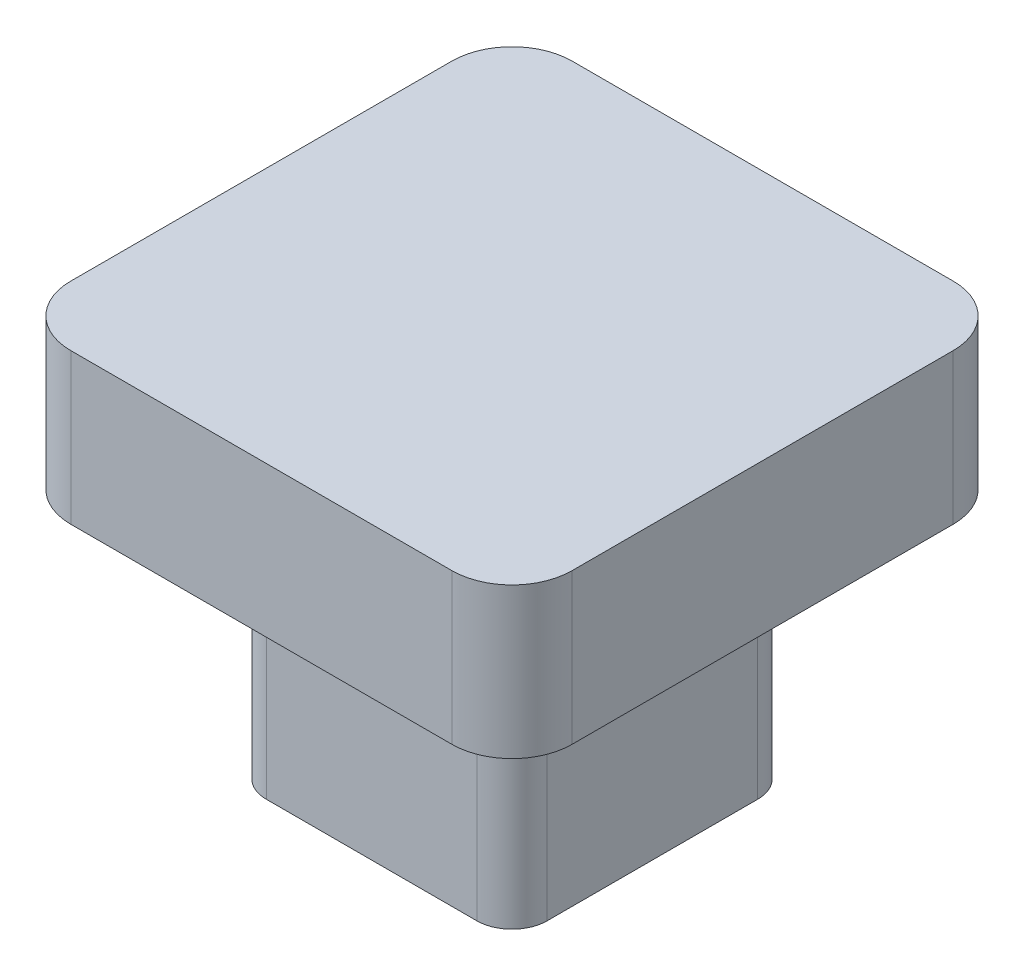
ISO-10303-21;
HEADER;
FILE_DESCRIPTION(('STEP AP214'),'2;1');
FILE_NAME('part.step','',(''),(''),'','','');
FILE_SCHEMA(('AUTOMOTIVE_DESIGN { 1 0 10303 214 1 1 1 1 }'));
ENDSEC;
DATA;
#1=APPLICATION_CONTEXT('core data for automotive mechanical design processes');
#2=APPLICATION_PROTOCOL_DEFINITION('international standard','automotive_design',2000,#1);
#3=PRODUCT_CONTEXT('',#1,'mechanical');
#4=PRODUCT('Part','Part','',(#3));
#5=PRODUCT_RELATED_PRODUCT_CATEGORY('part','',(#4));
#6=PRODUCT_DEFINITION_FORMATION('','',#4);
#7=PRODUCT_DEFINITION_CONTEXT('part definition',#1,'design');
#8=PRODUCT_DEFINITION('design','',#6,#7);
#9=PRODUCT_DEFINITION_SHAPE('','',#8);
#10=(LENGTH_UNIT() NAMED_UNIT(*) SI_UNIT(.MILLI.,.METRE.));
#11=(NAMED_UNIT(*) PLANE_ANGLE_UNIT() SI_UNIT($,.RADIAN.));
#12=(NAMED_UNIT(*) SI_UNIT($,.STERADIAN.) SOLID_ANGLE_UNIT());
#13=UNCERTAINTY_MEASURE_WITH_UNIT(LENGTH_MEASURE(1.E-05),#10,'distance_accuracy_value','');
#14=(GEOMETRIC_REPRESENTATION_CONTEXT(3) GLOBAL_UNCERTAINTY_ASSIGNED_CONTEXT((#13)) GLOBAL_UNIT_ASSIGNED_CONTEXT((#10,
#11,#12)) REPRESENTATION_CONTEXT('',''));
#15=CARTESIAN_POINT('',(0.,0.,0.));
#16=DIRECTION('',(0.,0.,1.));
#17=DIRECTION('',(1.,0.,0.));
#18=AXIS2_PLACEMENT_3D('',#15,#16,#17);
#19=CARTESIAN_POINT('',(-2.8,-5.,-2.8));
#20=DIRECTION('',(0.,1.,0.));
#21=DIRECTION('',(1.,0.,0.));
#22=AXIS2_PLACEMENT_3D('',#19,#20,#21);
#23=PLANE('',#22);
#24=CARTESIAN_POINT('',(2.1,-5.,-2.1));
#25=DIRECTION('',(0.,1.,0.));
#26=DIRECTION('',(0.,0.,1.));
#27=AXIS2_PLACEMENT_3D('',#24,#25,#26);
#28=CIRCLE('',#27,0.7);
#29=CARTESIAN_POINT('',(2.8,-5.,-2.1));
#30=VERTEX_POINT('',#29);
#31=CARTESIAN_POINT('',(2.1,-5.,-2.8));
#32=VERTEX_POINT('',#31);
#33=EDGE_CURVE('E322',#30,#32,#28,.T.);
#34=ORIENTED_EDGE('',*,*,#33,.F.);
#35=DIRECTION('',(0.,0.,1.));
#36=VECTOR('',#35,1.);
#37=CARTESIAN_POINT('',(2.8,-5.,-2.8));
#38=LINE('',#37,#36);
#39=CARTESIAN_POINT('',(2.8,-5.,2.1));
#40=VERTEX_POINT('',#39);
#41=EDGE_CURVE('E323',#30,#40,#38,.T.);
#42=ORIENTED_EDGE('',*,*,#41,.T.);
#43=CARTESIAN_POINT('',(2.1,-5.,2.1));
#44=DIRECTION('',(0.,-1.,0.));
#45=DIRECTION('',(0.,0.,1.));
#46=AXIS2_PLACEMENT_3D('',#43,#44,#45);
#47=CIRCLE('',#46,0.7);
#48=CARTESIAN_POINT('',(2.1,-5.,2.8));
#49=VERTEX_POINT('',#48);
#50=EDGE_CURVE('E202',#40,#49,#47,.T.);
#51=ORIENTED_EDGE('',*,*,#50,.T.);
#52=DIRECTION('',(1.,0.,0.));
#53=VECTOR('',#52,1.);
#54=CARTESIAN_POINT('',(-2.8,-5.,2.8));
#55=LINE('',#54,#53);
#56=CARTESIAN_POINT('',(-2.1,-5.,2.8));
#57=VERTEX_POINT('',#56);
#58=EDGE_CURVE('E330',#57,#49,#55,.T.);
#59=ORIENTED_EDGE('',*,*,#58,.F.);
#60=CARTESIAN_POINT('',(-2.1,-5.,2.1));
#61=DIRECTION('',(0.,1.,0.));
#62=DIRECTION('',(0.,0.,1.));
#63=AXIS2_PLACEMENT_3D('',#60,#61,#62);
#64=CIRCLE('',#63,0.7);
#65=CARTESIAN_POINT('',(-2.8,-5.,2.1));
#66=VERTEX_POINT('',#65);
#67=EDGE_CURVE('E241',#66,#57,#64,.T.);
#68=ORIENTED_EDGE('',*,*,#67,.F.);
#69=DIRECTION('',(0.,0.,1.));
#70=VECTOR('',#69,1.);
#71=CARTESIAN_POINT('',(-2.8,-5.,-2.8));
#72=LINE('',#71,#70);
#73=CARTESIAN_POINT('',(-2.8,-5.,-2.1));
#74=VERTEX_POINT('',#73);
#75=EDGE_CURVE('E237',#74,#66,#72,.T.);
#76=ORIENTED_EDGE('',*,*,#75,.F.);
#77=CARTESIAN_POINT('',(-2.1,-5.,-2.1));
#78=DIRECTION('',(0.,-1.,0.));
#79=DIRECTION('',(0.,0.,1.));
#80=AXIS2_PLACEMENT_3D('',#77,#78,#79);
#81=CIRCLE('',#80,0.7);
#82=CARTESIAN_POINT('',(-2.1,-5.,-2.8));
#83=VERTEX_POINT('',#82);
#84=EDGE_CURVE('E9',#74,#83,#81,.T.);
#85=ORIENTED_EDGE('',*,*,#84,.T.);
#86=DIRECTION('',(1.,0.,0.));
#87=VECTOR('',#86,1.);
#88=CARTESIAN_POINT('',(-2.8,-5.,-2.8));
#89=LINE('',#88,#87);
#90=EDGE_CURVE('E40',#83,#32,#89,.T.);
#91=ORIENTED_EDGE('',*,*,#90,.T.);
#92=EDGE_LOOP('',(#34,#42,#51,#59,#68,#76,#85,#91));
#93=FACE_BOUND('',#92,.T.);
#94=ADVANCED_FACE('F15',(#93),#23,.F.);
#95=CARTESIAN_POINT('',(-2.1,-5.,-2.1));
#96=DIRECTION('',(0.,1.,0.));
#97=DIRECTION('',(-1.,0.,0.));
#98=AXIS2_PLACEMENT_3D('',#95,#96,#97);
#99=CYLINDRICAL_SURFACE('',#98,0.7);
#100=DIRECTION('',(0.,1.,0.));
#101=VECTOR('',#100,1.);
#102=CARTESIAN_POINT('',(-2.8,-5.,-2.1));
#103=LINE('',#102,#101);
#104=CARTESIAN_POINT('',(-2.8,0.,-2.1));
#105=VERTEX_POINT('',#104);
#106=EDGE_CURVE('E242',#74,#105,#103,.T.);
#107=ORIENTED_EDGE('',*,*,#106,.T.);
#108=CARTESIAN_POINT('',(-2.1,0.,-2.1));
#109=DIRECTION('',(0.,-1.,0.));
#110=DIRECTION('',(0.,0.,1.));
#111=AXIS2_PLACEMENT_3D('',#108,#109,#110);
#112=CIRCLE('',#111,0.7);
#113=CARTESIAN_POINT('',(-2.1,0.,-2.8));
#114=VERTEX_POINT('',#113);
#115=EDGE_CURVE('E254',#105,#114,#112,.T.);
#116=ORIENTED_EDGE('',*,*,#115,.T.);
#117=DIRECTION('',(0.,1.,0.));
#118=VECTOR('',#117,1.);
#119=CARTESIAN_POINT('',(-2.1,-5.,-2.8));
#120=LINE('',#119,#118);
#121=EDGE_CURVE('E23',#83,#114,#120,.T.);
#122=ORIENTED_EDGE('',*,*,#121,.F.);
#123=ORIENTED_EDGE('',*,*,#84,.F.);
#124=EDGE_LOOP('',(#107,#116,#122,#123));
#125=FACE_BOUND('',#124,.T.);
#126=ADVANCED_FACE('F379',(#125),#99,.T.);
#127=CARTESIAN_POINT('',(-2.8,-5.,-2.8));
#128=DIRECTION('',(0.,0.,1.));
#129=DIRECTION('',(1.,0.,0.));
#130=AXIS2_PLACEMENT_3D('',#127,#128,#129);
#131=PLANE('',#130);
#132=DIRECTION('',(0.,1.,0.));
#133=VECTOR('',#132,1.);
#134=CARTESIAN_POINT('',(2.1,-5.,-2.8));
#135=LINE('',#134,#133);
#136=CARTESIAN_POINT('',(2.1,0.,-2.8));
#137=VERTEX_POINT('',#136);
#138=EDGE_CURVE('E287',#32,#137,#135,.T.);
#139=ORIENTED_EDGE('',*,*,#138,.F.);
#140=ORIENTED_EDGE('',*,*,#90,.F.);
#141=ORIENTED_EDGE('',*,*,#121,.T.);
#142=DIRECTION('',(1.,0.,0.));
#143=VECTOR('',#142,1.);
#144=CARTESIAN_POINT('',(-2.8,0.,-2.8));
#145=LINE('',#144,#143);
#146=EDGE_CURVE('E259',#114,#137,#145,.T.);
#147=ORIENTED_EDGE('',*,*,#146,.T.);
#148=EDGE_LOOP('',(#139,#140,#141,#147));
#149=FACE_BOUND('',#148,.T.);
#150=ADVANCED_FACE('F351',(#149),#131,.F.);
#151=CARTESIAN_POINT('',(2.1,-5.,-2.1));
#152=DIRECTION('',(0.,1.,0.));
#153=DIRECTION('',(1.,0.,0.));
#154=AXIS2_PLACEMENT_3D('',#151,#152,#153);
#155=CYLINDRICAL_SURFACE('',#154,0.7);
#156=ORIENTED_EDGE('',*,*,#33,.T.);
#157=ORIENTED_EDGE('',*,*,#138,.T.);
#158=CARTESIAN_POINT('',(2.1,0.,-2.1));
#159=DIRECTION('',(0.,1.,0.));
#160=DIRECTION('',(0.,0.,1.));
#161=AXIS2_PLACEMENT_3D('',#158,#159,#160);
#162=CIRCLE('',#161,0.7);
#163=CARTESIAN_POINT('',(2.8,0.,-2.1));
#164=VERTEX_POINT('',#163);
#165=EDGE_CURVE('E247',#164,#137,#162,.T.);
#166=ORIENTED_EDGE('',*,*,#165,.F.);
#167=DIRECTION('',(0.,1.,0.));
#168=VECTOR('',#167,1.);
#169=CARTESIAN_POINT('',(2.8,-5.,-2.1));
#170=LINE('',#169,#168);
#171=EDGE_CURVE('E319',#30,#164,#170,.T.);
#172=ORIENTED_EDGE('',*,*,#171,.F.);
#173=EDGE_LOOP('',(#156,#157,#166,#172));
#174=FACE_BOUND('',#173,.T.);
#175=ADVANCED_FACE('F346',(#174),#155,.T.);
#176=CARTESIAN_POINT('',(2.8,-5.,-2.8));
#177=DIRECTION('',(1.,0.,0.));
#178=DIRECTION('',(0.,1.,0.));
#179=AXIS2_PLACEMENT_3D('',#176,#177,#178);
#180=PLANE('',#179);
#181=ORIENTED_EDGE('',*,*,#41,.F.);
#182=ORIENTED_EDGE('',*,*,#171,.T.);
#183=DIRECTION('',(0.,0.,1.));
#184=VECTOR('',#183,1.);
#185=CARTESIAN_POINT('',(2.8,0.,-2.8));
#186=LINE('',#185,#184);
#187=CARTESIAN_POINT('',(2.8,0.,2.1));
#188=VERTEX_POINT('',#187);
#189=EDGE_CURVE('E243',#164,#188,#186,.T.);
#190=ORIENTED_EDGE('',*,*,#189,.T.);
#191=DIRECTION('',(0.,1.,0.));
#192=VECTOR('',#191,1.);
#193=CARTESIAN_POINT('',(2.8,-5.,2.1));
#194=LINE('',#193,#192);
#195=EDGE_CURVE('E210',#40,#188,#194,.T.);
#196=ORIENTED_EDGE('',*,*,#195,.F.);
#197=EDGE_LOOP('',(#181,#182,#190,#196));
#198=FACE_BOUND('',#197,.T.);
#199=ADVANCED_FACE('F358',(#198),#180,.T.);
#200=CARTESIAN_POINT('',(2.1,-5.,2.1));
#201=DIRECTION('',(0.,1.,0.));
#202=DIRECTION('',(1.,0.,0.));
#203=AXIS2_PLACEMENT_3D('',#200,#201,#202);
#204=CYLINDRICAL_SURFACE('',#203,0.7);
#205=ORIENTED_EDGE('',*,*,#195,.T.);
#206=CARTESIAN_POINT('',(2.1,0.,2.1));
#207=DIRECTION('',(0.,-1.,0.));
#208=DIRECTION('',(0.,0.,1.));
#209=AXIS2_PLACEMENT_3D('',#206,#207,#208);
#210=CIRCLE('',#209,0.7);
#211=CARTESIAN_POINT('',(2.1,0.,2.8));
#212=VERTEX_POINT('',#211);
#213=EDGE_CURVE('E232',#188,#212,#210,.T.);
#214=ORIENTED_EDGE('',*,*,#213,.T.);
#215=DIRECTION('',(0.,1.,0.));
#216=VECTOR('',#215,1.);
#217=CARTESIAN_POINT('',(2.1,-5.,2.8));
#218=LINE('',#217,#216);
#219=EDGE_CURVE('E213',#49,#212,#218,.T.);
#220=ORIENTED_EDGE('',*,*,#219,.F.);
#221=ORIENTED_EDGE('',*,*,#50,.F.);
#222=EDGE_LOOP('',(#205,#214,#220,#221));
#223=FACE_BOUND('',#222,.T.);
#224=ADVANCED_FACE('F362',(#223),#204,.T.);
#225=CARTESIAN_POINT('',(-2.8,-5.,2.8));
#226=DIRECTION('',(0.,0.,1.));
#227=DIRECTION('',(1.,0.,0.));
#228=AXIS2_PLACEMENT_3D('',#225,#226,#227);
#229=PLANE('',#228);
#230=DIRECTION('',(1.,0.,0.));
#231=VECTOR('',#230,1.);
#232=CARTESIAN_POINT('',(-2.8,0.,2.8));
#233=LINE('',#232,#231);
#234=CARTESIAN_POINT('',(-2.1,0.,2.8));
#235=VERTEX_POINT('',#234);
#236=EDGE_CURVE('E228',#235,#212,#233,.T.);
#237=ORIENTED_EDGE('',*,*,#236,.F.);
#238=DIRECTION('',(0.,1.,0.));
#239=VECTOR('',#238,1.);
#240=CARTESIAN_POINT('',(-2.1,-5.,2.8));
#241=LINE('',#240,#239);
#242=EDGE_CURVE('E280',#57,#235,#241,.T.);
#243=ORIENTED_EDGE('',*,*,#242,.F.);
#244=ORIENTED_EDGE('',*,*,#58,.T.);
#245=ORIENTED_EDGE('',*,*,#219,.T.);
#246=EDGE_LOOP('',(#237,#243,#244,#245));
#247=FACE_BOUND('',#246,.T.);
#248=ADVANCED_FACE('F369',(#247),#229,.T.);
#249=CARTESIAN_POINT('',(-2.1,-5.,2.1));
#250=DIRECTION('',(0.,1.,0.));
#251=DIRECTION('',(-1.,0.,0.));
#252=AXIS2_PLACEMENT_3D('',#249,#250,#251);
#253=CYLINDRICAL_SURFACE('',#252,0.7);
#254=ORIENTED_EDGE('',*,*,#67,.T.);
#255=ORIENTED_EDGE('',*,*,#242,.T.);
#256=CARTESIAN_POINT('',(-2.1,0.,2.1));
#257=DIRECTION('',(0.,1.,0.));
#258=DIRECTION('',(0.,0.,1.));
#259=AXIS2_PLACEMENT_3D('',#256,#257,#258);
#260=CIRCLE('',#259,0.7);
#261=CARTESIAN_POINT('',(-2.8,0.,2.1));
#262=VERTEX_POINT('',#261);
#263=EDGE_CURVE('E233',#262,#235,#260,.T.);
#264=ORIENTED_EDGE('',*,*,#263,.F.);
#265=DIRECTION('',(0.,1.,0.));
#266=VECTOR('',#265,1.);
#267=CARTESIAN_POINT('',(-2.8,-5.,2.1));
#268=LINE('',#267,#266);
#269=EDGE_CURVE('E310',#66,#262,#268,.T.);
#270=ORIENTED_EDGE('',*,*,#269,.F.);
#271=EDGE_LOOP('',(#254,#255,#264,#270));
#272=FACE_BOUND('',#271,.T.);
#273=ADVANCED_FACE('F377',(#272),#253,.T.);
#274=CARTESIAN_POINT('',(-2.8,-5.,-2.8));
#275=DIRECTION('',(1.,0.,0.));
#276=DIRECTION('',(0.,1.,0.));
#277=AXIS2_PLACEMENT_3D('',#274,#275,#276);
#278=PLANE('',#277);
#279=ORIENTED_EDGE('',*,*,#269,.T.);
#280=DIRECTION('',(0.,0.,1.));
#281=VECTOR('',#280,1.);
#282=CARTESIAN_POINT('',(-2.8,0.,-2.8));
#283=LINE('',#282,#281);
#284=EDGE_CURVE('E258',#105,#262,#283,.T.);
#285=ORIENTED_EDGE('',*,*,#284,.F.);
#286=ORIENTED_EDGE('',*,*,#106,.F.);
#287=ORIENTED_EDGE('',*,*,#75,.T.);
#288=EDGE_LOOP('',(#279,#285,#286,#287));
#289=FACE_BOUND('',#288,.T.);
#290=ADVANCED_FACE('F374',(#289),#278,.F.);
#291=CARTESIAN_POINT('',(-5.,0.,5.));
#292=DIRECTION('',(0.,0.,1.));
#293=DIRECTION('',(1.,0.,0.));
#294=AXIS2_PLACEMENT_3D('',#291,#292,#293);
#295=PLANE('',#294);
#296=DIRECTION('',(1.,0.,0.));
#297=VECTOR('',#296,1.);
#298=CARTESIAN_POINT('',(-5.,3.,5.));
#299=LINE('',#298,#297);
#300=CARTESIAN_POINT('',(-3.8,3.,5.));
#301=VERTEX_POINT('',#300);
#302=CARTESIAN_POINT('',(3.8,3.,5.));
#303=VERTEX_POINT('',#302);
#304=EDGE_CURVE('E214',#301,#303,#299,.T.);
#305=ORIENTED_EDGE('',*,*,#304,.F.);
#306=DIRECTION('',(0.,1.,0.));
#307=VECTOR('',#306,1.);
#308=CARTESIAN_POINT('',(-3.8,0.,5.));
#309=LINE('',#308,#307);
#310=CARTESIAN_POINT('',(-3.8,0.,5.));
#311=VERTEX_POINT('',#310);
#312=EDGE_CURVE('E284',#311,#301,#309,.T.);
#313=ORIENTED_EDGE('',*,*,#312,.F.);
#314=DIRECTION('',(1.,0.,0.));
#315=VECTOR('',#314,1.);
#316=CARTESIAN_POINT('',(-5.,0.,5.));
#317=LINE('',#316,#315);
#318=CARTESIAN_POINT('',(3.8,0.,5.));
#319=VERTEX_POINT('',#318);
#320=EDGE_CURVE('E173',#311,#319,#317,.T.);
#321=ORIENTED_EDGE('',*,*,#320,.T.);
#322=DIRECTION('',(0.,1.,0.));
#323=VECTOR('',#322,1.);
#324=CARTESIAN_POINT('',(3.8,0.,5.));
#325=LINE('',#324,#323);
#326=EDGE_CURVE('E307',#319,#303,#325,.T.);
#327=ORIENTED_EDGE('',*,*,#326,.T.);
#328=EDGE_LOOP('',(#305,#313,#321,#327));
#329=FACE_BOUND('',#328,.T.);
#330=ADVANCED_FACE('F396',(#329),#295,.T.);
#331=CARTESIAN_POINT('',(3.8,0.,3.8));
#332=DIRECTION('',(0.,1.,0.));
#333=DIRECTION('',(1.,0.,0.));
#334=AXIS2_PLACEMENT_3D('',#331,#332,#333);
#335=CYLINDRICAL_SURFACE('',#334,1.2);
#336=DIRECTION('',(0.,1.,0.));
#337=VECTOR('',#336,1.);
#338=CARTESIAN_POINT('',(5.,0.,3.8));
#339=LINE('',#338,#337);
#340=CARTESIAN_POINT('',(5.,0.,3.8));
#341=VERTEX_POINT('',#340);
#342=CARTESIAN_POINT('',(5.,3.,3.8));
#343=VERTEX_POINT('',#342);
#344=EDGE_CURVE('E311',#341,#343,#339,.T.);
#345=ORIENTED_EDGE('',*,*,#344,.T.);
#346=CARTESIAN_POINT('',(3.8,3.,3.8));
#347=DIRECTION('',(0.,-1.,0.));
#348=DIRECTION('',(0.,0.,1.));
#349=AXIS2_PLACEMENT_3D('',#346,#347,#348);
#350=CIRCLE('',#349,1.2);
#351=EDGE_CURVE('E218',#343,#303,#350,.T.);
#352=ORIENTED_EDGE('',*,*,#351,.T.);
#353=ORIENTED_EDGE('',*,*,#326,.F.);
#354=CARTESIAN_POINT('',(3.8,0.,3.8));
#355=DIRECTION('',(0.,-1.,0.));
#356=DIRECTION('',(0.,0.,1.));
#357=AXIS2_PLACEMENT_3D('',#354,#355,#356);
#358=CIRCLE('',#357,1.2);
#359=EDGE_CURVE('E220',#341,#319,#358,.T.);
#360=ORIENTED_EDGE('',*,*,#359,.F.);
#361=EDGE_LOOP('',(#345,#352,#353,#360));
#362=FACE_BOUND('',#361,.T.);
#363=ADVANCED_FACE('F397',(#362),#335,.T.);
#364=CARTESIAN_POINT('',(5.,0.,-5.));
#365=DIRECTION('',(1.,0.,0.));
#366=DIRECTION('',(0.,1.,0.));
#367=AXIS2_PLACEMENT_3D('',#364,#365,#366);
#368=PLANE('',#367);
#369=DIRECTION('',(0.,0.,1.));
#370=VECTOR('',#369,1.);
#371=CARTESIAN_POINT('',(5.,0.,-5.));
#372=LINE('',#371,#370);
#373=CARTESIAN_POINT('',(5.,0.,-3.8));
#374=VERTEX_POINT('',#373);
#375=EDGE_CURVE('E208',#374,#341,#372,.T.);
#376=ORIENTED_EDGE('',*,*,#375,.F.);
#377=DIRECTION('',(0.,1.,0.));
#378=VECTOR('',#377,1.);
#379=CARTESIAN_POINT('',(5.,0.,-3.8));
#380=LINE('',#379,#378);
#381=CARTESIAN_POINT('',(5.,3.,-3.8));
#382=VERTEX_POINT('',#381);
#383=EDGE_CURVE('E314',#374,#382,#380,.T.);
#384=ORIENTED_EDGE('',*,*,#383,.T.);
#385=DIRECTION('',(0.,0.,1.));
#386=VECTOR('',#385,1.);
#387=CARTESIAN_POINT('',(5.,3.,-5.));
#388=LINE('',#387,#386);
#389=EDGE_CURVE('E298',#382,#343,#388,.T.);
#390=ORIENTED_EDGE('',*,*,#389,.T.);
#391=ORIENTED_EDGE('',*,*,#344,.F.);
#392=EDGE_LOOP('',(#376,#384,#390,#391));
#393=FACE_BOUND('',#392,.T.);
#394=ADVANCED_FACE('F400',(#393),#368,.T.);
#395=CARTESIAN_POINT('',(3.8,0.,-3.8));
#396=DIRECTION('',(0.,1.,0.));
#397=DIRECTION('',(1.,0.,0.));
#398=AXIS2_PLACEMENT_3D('',#395,#396,#397);
#399=CYLINDRICAL_SURFACE('',#398,1.2);
#400=CARTESIAN_POINT('',(3.8,0.,-3.8));
#401=DIRECTION('',(0.,1.,0.));
#402=DIRECTION('',(0.,0.,1.));
#403=AXIS2_PLACEMENT_3D('',#400,#401,#402);
#404=CIRCLE('',#403,1.2);
#405=CARTESIAN_POINT('',(3.8,0.,-5.));
#406=VERTEX_POINT('',#405);
#407=EDGE_CURVE('E188',#374,#406,#404,.T.);
#408=ORIENTED_EDGE('',*,*,#407,.T.);
#409=DIRECTION('',(0.,1.,0.));
#410=VECTOR('',#409,1.);
#411=CARTESIAN_POINT('',(3.8,0.,-5.));
#412=LINE('',#411,#410);
#413=CARTESIAN_POINT('',(3.8,3.,-5.));
#414=VERTEX_POINT('',#413);
#415=EDGE_CURVE('E306',#406,#414,#412,.T.);
#416=ORIENTED_EDGE('',*,*,#415,.T.);
#417=CARTESIAN_POINT('',(3.8,3.,-3.8));
#418=DIRECTION('',(0.,1.,0.));
#419=DIRECTION('',(0.,0.,1.));
#420=AXIS2_PLACEMENT_3D('',#417,#418,#419);
#421=CIRCLE('',#420,1.2);
#422=EDGE_CURVE('E302',#382,#414,#421,.T.);
#423=ORIENTED_EDGE('',*,*,#422,.F.);
#424=ORIENTED_EDGE('',*,*,#383,.F.);
#425=EDGE_LOOP('',(#408,#416,#423,#424));
#426=FACE_BOUND('',#425,.T.);
#427=ADVANCED_FACE('F404',(#426),#399,.T.);
#428=CARTESIAN_POINT('',(-5.,0.,-5.));
#429=DIRECTION('',(0.,0.,1.));
#430=DIRECTION('',(1.,0.,0.));
#431=AXIS2_PLACEMENT_3D('',#428,#429,#430);
#432=PLANE('',#431);
#433=ORIENTED_EDGE('',*,*,#415,.F.);
#434=DIRECTION('',(1.,0.,0.));
#435=VECTOR('',#434,1.);
#436=CARTESIAN_POINT('',(-5.,0.,-5.));
#437=LINE('',#436,#435);
#438=CARTESIAN_POINT('',(-3.8,0.,-5.));
#439=VERTEX_POINT('',#438);
#440=EDGE_CURVE('E235',#439,#406,#437,.T.);
#441=ORIENTED_EDGE('',*,*,#440,.F.);
#442=DIRECTION('',(0.,1.,0.));
#443=VECTOR('',#442,1.);
#444=CARTESIAN_POINT('',(-3.8,0.,-5.));
#445=LINE('',#444,#443);
#446=CARTESIAN_POINT('',(-3.8,3.,-5.));
#447=VERTEX_POINT('',#446);
#448=EDGE_CURVE('E276',#439,#447,#445,.T.);
#449=ORIENTED_EDGE('',*,*,#448,.T.);
#450=DIRECTION('',(1.,0.,0.));
#451=VECTOR('',#450,1.);
#452=CARTESIAN_POINT('',(-5.,3.,-5.));
#453=LINE('',#452,#451);
#454=EDGE_CURVE('E219',#447,#414,#453,.T.);
#455=ORIENTED_EDGE('',*,*,#454,.T.);
#456=EDGE_LOOP('',(#433,#441,#449,#455));
#457=FACE_BOUND('',#456,.T.);
#458=ADVANCED_FACE('F406',(#457),#432,.F.);
#459=CARTESIAN_POINT('',(-5.,3.,-5.));
#460=DIRECTION('',(0.,1.,0.));
#461=DIRECTION('',(1.,0.,0.));
#462=AXIS2_PLACEMENT_3D('',#459,#460,#461);
#463=PLANE('',#462);
#464=ORIENTED_EDGE('',*,*,#454,.F.);
#465=CARTESIAN_POINT('',(-3.8,3.,-3.8));
#466=DIRECTION('',(0.,-1.,0.));
#467=DIRECTION('',(0.,0.,1.));
#468=AXIS2_PLACEMENT_3D('',#465,#466,#467);
#469=CIRCLE('',#468,1.2);
#470=CARTESIAN_POINT('',(-5.,3.,-3.8));
#471=VERTEX_POINT('',#470);
#472=EDGE_CURVE('E272',#471,#447,#469,.T.);
#473=ORIENTED_EDGE('',*,*,#472,.F.);
#474=DIRECTION('',(0.,0.,1.));
#475=VECTOR('',#474,1.);
#476=CARTESIAN_POINT('',(-5.,3.,-5.));
#477=LINE('',#476,#475);
#478=CARTESIAN_POINT('',(-5.,3.,3.8));
#479=VERTEX_POINT('',#478);
#480=EDGE_CURVE('E195',#471,#479,#477,.T.);
#481=ORIENTED_EDGE('',*,*,#480,.T.);
#482=CARTESIAN_POINT('',(-3.8,3.,3.8));
#483=DIRECTION('',(0.,1.,0.));
#484=DIRECTION('',(0.,0.,1.));
#485=AXIS2_PLACEMENT_3D('',#482,#483,#484);
#486=CIRCLE('',#485,1.2);
#487=EDGE_CURVE('E192',#479,#301,#486,.T.);
#488=ORIENTED_EDGE('',*,*,#487,.T.);
#489=ORIENTED_EDGE('',*,*,#304,.T.);
#490=ORIENTED_EDGE('',*,*,#351,.F.);
#491=ORIENTED_EDGE('',*,*,#389,.F.);
#492=ORIENTED_EDGE('',*,*,#422,.T.);
#493=EDGE_LOOP('',(#464,#473,#481,#488,#489,#490,#491,#492));
#494=FACE_BOUND('',#493,.T.);
#495=ADVANCED_FACE('F409',(#494),#463,.T.);
#496=CARTESIAN_POINT('',(-3.8,0.,3.8));
#497=DIRECTION('',(0.,1.,0.));
#498=DIRECTION('',(-1.,0.,0.));
#499=AXIS2_PLACEMENT_3D('',#496,#497,#498);
#500=CYLINDRICAL_SURFACE('',#499,1.2);
#501=CARTESIAN_POINT('',(-3.8,0.,3.8));
#502=DIRECTION('',(0.,1.,0.));
#503=DIRECTION('',(0.,0.,1.));
#504=AXIS2_PLACEMENT_3D('',#501,#502,#503);
#505=CIRCLE('',#504,1.2);
#506=CARTESIAN_POINT('',(-5.,0.,3.8));
#507=VERTEX_POINT('',#506);
#508=EDGE_CURVE('E164',#507,#311,#505,.T.);
#509=ORIENTED_EDGE('',*,*,#508,.T.);
#510=ORIENTED_EDGE('',*,*,#312,.T.);
#511=ORIENTED_EDGE('',*,*,#487,.F.);
#512=DIRECTION('',(0.,1.,0.));
#513=VECTOR('',#512,1.);
#514=CARTESIAN_POINT('',(-5.,0.,3.8));
#515=LINE('',#514,#513);
#516=EDGE_CURVE('E184',#507,#479,#515,.T.);
#517=ORIENTED_EDGE('',*,*,#516,.F.);
#518=EDGE_LOOP('',(#509,#510,#511,#517));
#519=FACE_BOUND('',#518,.T.);
#520=ADVANCED_FACE('F190',(#519),#500,.T.);
#521=CARTESIAN_POINT('',(-3.8,0.,-3.8));
#522=DIRECTION('',(0.,1.,0.));
#523=DIRECTION('',(-1.,0.,0.));
#524=AXIS2_PLACEMENT_3D('',#521,#522,#523);
#525=CYLINDRICAL_SURFACE('',#524,1.2);
#526=DIRECTION('',(0.,1.,0.));
#527=VECTOR('',#526,1.);
#528=CARTESIAN_POINT('',(-5.,0.,-3.8));
#529=LINE('',#528,#527);
#530=CARTESIAN_POINT('',(-5.,0.,-3.8));
#531=VERTEX_POINT('',#530);
#532=EDGE_CURVE('E186',#531,#471,#529,.T.);
#533=ORIENTED_EDGE('',*,*,#532,.T.);
#534=ORIENTED_EDGE('',*,*,#472,.T.);
#535=ORIENTED_EDGE('',*,*,#448,.F.);
#536=CARTESIAN_POINT('',(-3.8,0.,-3.8));
#537=DIRECTION('',(0.,-1.,0.));
#538=DIRECTION('',(0.,0.,1.));
#539=AXIS2_PLACEMENT_3D('',#536,#537,#538);
#540=CIRCLE('',#539,1.2);
#541=EDGE_CURVE('E178',#531,#439,#540,.T.);
#542=ORIENTED_EDGE('',*,*,#541,.F.);
#543=EDGE_LOOP('',(#533,#534,#535,#542));
#544=FACE_BOUND('',#543,.T.);
#545=ADVANCED_FACE('F421',(#544),#525,.T.);
#546=CARTESIAN_POINT('',(-5.,0.,-5.));
#547=DIRECTION('',(0.,1.,0.));
#548=DIRECTION('',(1.,0.,0.));
#549=AXIS2_PLACEMENT_3D('',#546,#547,#548);
#550=PLANE('',#549);
#551=ORIENTED_EDGE('',*,*,#263,.T.);
#552=ORIENTED_EDGE('',*,*,#236,.T.);
#553=ORIENTED_EDGE('',*,*,#213,.F.);
#554=ORIENTED_EDGE('',*,*,#189,.F.);
#555=ORIENTED_EDGE('',*,*,#165,.T.);
#556=ORIENTED_EDGE('',*,*,#146,.F.);
#557=ORIENTED_EDGE('',*,*,#115,.F.);
#558=ORIENTED_EDGE('',*,*,#284,.T.);
#559=EDGE_LOOP('',(#551,#552,#553,#554,#555,#556,#557,#558));
#560=FACE_BOUND('',#559,.T.);
#561=ORIENTED_EDGE('',*,*,#407,.F.);
#562=ORIENTED_EDGE('',*,*,#375,.T.);
#563=ORIENTED_EDGE('',*,*,#359,.T.);
#564=ORIENTED_EDGE('',*,*,#320,.F.);
#565=ORIENTED_EDGE('',*,*,#508,.F.);
#566=DIRECTION('',(0.,0.,1.));
#567=VECTOR('',#566,1.);
#568=CARTESIAN_POINT('',(-5.,0.,-5.));
#569=LINE('',#568,#567);
#570=EDGE_CURVE('E169',#531,#507,#569,.T.);
#571=ORIENTED_EDGE('',*,*,#570,.F.);
#572=ORIENTED_EDGE('',*,*,#541,.T.);
#573=ORIENTED_EDGE('',*,*,#440,.T.);
#574=EDGE_LOOP('',(#561,#562,#563,#564,#565,#571,#572,#573));
#575=FACE_BOUND('',#574,.T.);
#576=ADVANCED_FACE('F167',(#560,#575),#550,.F.);
#577=CARTESIAN_POINT('',(-5.,0.,-5.));
#578=DIRECTION('',(1.,0.,0.));
#579=DIRECTION('',(0.,1.,0.));
#580=AXIS2_PLACEMENT_3D('',#577,#578,#579);
#581=PLANE('',#580);
#582=ORIENTED_EDGE('',*,*,#516,.T.);
#583=ORIENTED_EDGE('',*,*,#480,.F.);
#584=ORIENTED_EDGE('',*,*,#532,.F.);
#585=ORIENTED_EDGE('',*,*,#570,.T.);
#586=EDGE_LOOP('',(#582,#583,#584,#585));
#587=FACE_BOUND('',#586,.T.);
#588=ADVANCED_FACE('F182',(#587),#581,.F.);
#589=CLOSED_SHELL('',(#94,#126,#150,#175,#199,#224,#248,#273,#290,#330,#363,#394,#427,#458,#495,
#520,#545,#576,#588));
#590=MANIFOLD_SOLID_BREP('B1',#589);
#591=ADVANCED_BREP_SHAPE_REPRESENTATION('',(#18,#590),#14);
#592=SHAPE_DEFINITION_REPRESENTATION(#9,#591);
ENDSEC;
END-ISO-10303-21;
